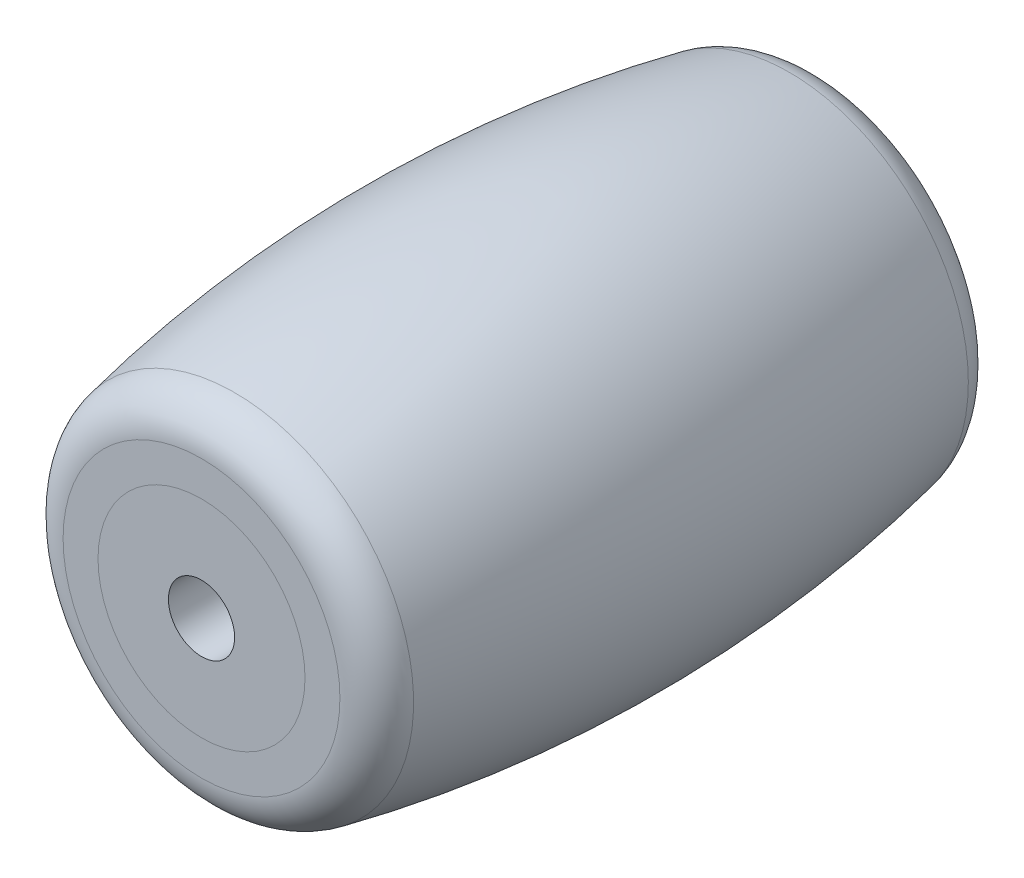
ISO-10303-21;
HEADER;
FILE_DESCRIPTION(('STEP AP214'),'2;1');
FILE_NAME('part.step','',(''),(''),'','','');
FILE_SCHEMA(('AUTOMOTIVE_DESIGN { 1 0 10303 214 1 1 1 1 }'));
ENDSEC;
DATA;
#1=APPLICATION_CONTEXT('core data for automotive mechanical design processes');
#2=APPLICATION_PROTOCOL_DEFINITION('international standard','automotive_design',2000,#1);
#3=PRODUCT_CONTEXT('',#1,'mechanical');
#4=PRODUCT('Part','Part','',(#3));
#5=PRODUCT_RELATED_PRODUCT_CATEGORY('part','',(#4));
#6=PRODUCT_DEFINITION_FORMATION('','',#4);
#7=PRODUCT_DEFINITION_CONTEXT('part definition',#1,'design');
#8=PRODUCT_DEFINITION('design','',#6,#7);
#9=PRODUCT_DEFINITION_SHAPE('','',#8);
#10=(LENGTH_UNIT() NAMED_UNIT(*) SI_UNIT(.MILLI.,.METRE.));
#11=(NAMED_UNIT(*) PLANE_ANGLE_UNIT() SI_UNIT($,.RADIAN.));
#12=(NAMED_UNIT(*) SI_UNIT($,.STERADIAN.) SOLID_ANGLE_UNIT());
#13=UNCERTAINTY_MEASURE_WITH_UNIT(LENGTH_MEASURE(1.E-05),#10,'distance_accuracy_value','');
#14=(GEOMETRIC_REPRESENTATION_CONTEXT(3) GLOBAL_UNCERTAINTY_ASSIGNED_CONTEXT((#13)) GLOBAL_UNIT_ASSIGNED_CONTEXT((#10,
#11,#12)) REPRESENTATION_CONTEXT('',''));
#15=CARTESIAN_POINT('',(0.,0.,0.));
#16=DIRECTION('',(0.,0.,1.));
#17=DIRECTION('',(1.,0.,0.));
#18=AXIS2_PLACEMENT_3D('',#15,#16,#17);
#19=CARTESIAN_POINT('',(0.,0.,15.));
#20=DIRECTION('',(0.,0.,1.));
#21=DIRECTION('',(1.,0.,0.));
#22=AXIS2_PLACEMENT_3D('',#19,#20,#21);
#23=PLANE('',#22);
#24=CARTESIAN_POINT('',(0.,0.,15.));
#25=DIRECTION('',(0.,0.,1.));
#26=DIRECTION('',(1.,0.,0.));
#27=AXIS2_PLACEMENT_3D('',#24,#25,#26);
#28=CIRCLE('',#27,5.);
#29=CARTESIAN_POINT('',(5.,0.,15.));
#30=VERTEX_POINT('',#29);
#31=EDGE_CURVE('E11',#30,#30,#28,.T.);
#32=ORIENTED_EDGE('',*,*,#31,.T.);
#33=EDGE_LOOP('',(#32));
#34=FACE_BOUND('',#33,.T.);
#35=CARTESIAN_POINT('',(0.,0.,15.));
#36=DIRECTION('',(0.,0.,1.));
#37=DIRECTION('',(1.,0.,0.));
#38=AXIS2_PLACEMENT_3D('',#35,#36,#37);
#39=CIRCLE('',#38,1.6);
#40=CARTESIAN_POINT('',(1.6,0.,15.));
#41=VERTEX_POINT('',#40);
#42=EDGE_CURVE('E54',#41,#41,#39,.T.);
#43=ORIENTED_EDGE('',*,*,#42,.F.);
#44=EDGE_LOOP('',(#43));
#45=FACE_BOUND('',#44,.T.);
#46=ADVANCED_FACE('F47',(#34,#45),#23,.T.);
#47=CARTESIAN_POINT('',(0.,0.,15.));
#48=DIRECTION('',(0.,0.,-1.));
#49=DIRECTION('',(-1.,0.,0.));
#50=AXIS2_PLACEMENT_3D('',#47,#48,#49);
#51=CYLINDRICAL_SURFACE('',#50,5.);
#52=ORIENTED_EDGE('',*,*,#31,.F.);
#53=EDGE_LOOP('',(#52));
#54=FACE_BOUND('',#53,.T.);
#55=CARTESIAN_POINT('',(0.,0.,-15.));
#56=DIRECTION('',(0.,0.,1.));
#57=DIRECTION('',(1.,0.,0.));
#58=AXIS2_PLACEMENT_3D('',#55,#56,#57);
#59=CIRCLE('',#58,5.);
#60=CARTESIAN_POINT('',(5.,0.,-15.));
#61=VERTEX_POINT('',#60);
#62=EDGE_CURVE('E58',#61,#61,#59,.T.);
#63=ORIENTED_EDGE('',*,*,#62,.T.);
#64=EDGE_LOOP('',(#63));
#65=FACE_BOUND('',#64,.T.);
#66=ADVANCED_FACE('F49',(#54,#65),#51,.T.);
#67=CARTESIAN_POINT('',(0.,0.,15.));
#68=DIRECTION('',(0.,0.,-1.));
#69=DIRECTION('',(-1.,0.,0.));
#70=AXIS2_PLACEMENT_3D('',#67,#68,#69);
#71=CYLINDRICAL_SURFACE('',#70,1.6);
#72=ORIENTED_EDGE('',*,*,#42,.T.);
#73=EDGE_LOOP('',(#72));
#74=FACE_BOUND('',#73,.T.);
#75=CARTESIAN_POINT('',(0.,0.,-15.));
#76=DIRECTION('',(0.,0.,1.));
#77=DIRECTION('',(1.,0.,0.));
#78=AXIS2_PLACEMENT_3D('',#75,#76,#77);
#79=CIRCLE('',#78,1.6);
#80=CARTESIAN_POINT('',(1.6,0.,-15.));
#81=VERTEX_POINT('',#80);
#82=EDGE_CURVE('E62',#81,#81,#79,.T.);
#83=ORIENTED_EDGE('',*,*,#82,.F.);
#84=EDGE_LOOP('',(#83));
#85=FACE_BOUND('',#84,.T.);
#86=ADVANCED_FACE('F71',(#74,#85),#71,.F.);
#87=CARTESIAN_POINT('',(0.,0.,-15.));
#88=DIRECTION('',(0.,0.,1.));
#89=DIRECTION('',(1.,0.,0.));
#90=AXIS2_PLACEMENT_3D('',#87,#88,#89);
#91=PLANE('',#90);
#92=ORIENTED_EDGE('',*,*,#82,.T.);
#93=EDGE_LOOP('',(#92));
#94=FACE_BOUND('',#93,.T.);
#95=ORIENTED_EDGE('',*,*,#62,.F.);
#96=EDGE_LOOP('',(#95));
#97=FACE_BOUND('',#96,.T.);
#98=ADVANCED_FACE('F68',(#94,#97),#91,.F.);
#99=CLOSED_SHELL('',(#46,#66,#86,#98));
#100=MANIFOLD_SOLID_BREP('B2',#99);
#101=CARTESIAN_POINT('',(0.,5.,15.));
#102=DIRECTION('',(0.,0.,-1.));
#103=DIRECTION('',(-1.,0.,0.));
#104=AXIS2_PLACEMENT_3D('',#101,#102,#103);
#105=PLANE('',#104);
#106=CARTESIAN_POINT('',(0.,0.,15.));
#107=DIRECTION('',(0.,0.,-1.));
#108=DIRECTION('',(-1.,0.,0.));
#109=AXIS2_PLACEMENT_3D('',#106,#107,#108);
#110=CIRCLE('',#109,6.68673331236264);
#111=CARTESIAN_POINT('',(-6.68673331236264,0.,15.));
#112=VERTEX_POINT('',#111);
#113=EDGE_CURVE('E46',#112,#112,#110,.F.);
#114=ORIENTED_EDGE('',*,*,#113,.T.);
#115=EDGE_LOOP('',(#114));
#116=FACE_BOUND('',#115,.T.);
#117=CARTESIAN_POINT('',(0.,0.,15.));
#118=DIRECTION('',(0.,0.,1.));
#119=DIRECTION('',(1.,0.,0.));
#120=AXIS2_PLACEMENT_3D('',#117,#118,#119);
#121=CIRCLE('',#120,5.);
#122=CARTESIAN_POINT('',(5.,0.,15.));
#123=VERTEX_POINT('',#122);
#124=EDGE_CURVE('E137',#123,#123,#121,.T.);
#125=ORIENTED_EDGE('',*,*,#124,.F.);
#126=EDGE_LOOP('',(#125));
#127=FACE_BOUND('',#126,.T.);
#128=ADVANCED_FACE('F117',(#116,#127),#105,.F.);
#129=CARTESIAN_POINT('',(0.,0.,18.551269556302));
#130=DIRECTION('',(0.,0.,1.));
#131=DIRECTION('',(1.,0.,0.));
#132=AXIS2_PLACEMENT_3D('',#129,#130,#131);
#133=CYLINDRICAL_SURFACE('',#132,5.);
#134=CARTESIAN_POINT('',(0.,0.,-15.));
#135=DIRECTION('',(0.,0.,1.));
#136=DIRECTION('',(1.,0.,0.));
#137=AXIS2_PLACEMENT_3D('',#134,#135,#136);
#138=CIRCLE('',#137,5.);
#139=CARTESIAN_POINT('',(5.,0.,-15.));
#140=VERTEX_POINT('',#139);
#141=EDGE_CURVE('E140',#140,#140,#138,.T.);
#142=ORIENTED_EDGE('',*,*,#141,.F.);
#143=EDGE_LOOP('',(#142));
#144=FACE_BOUND('',#143,.T.);
#145=ORIENTED_EDGE('',*,*,#124,.T.);
#146=EDGE_LOOP('',(#145));
#147=FACE_BOUND('',#146,.T.);
#148=ADVANCED_FACE('F146',(#144,#147),#133,.F.);
#149=CARTESIAN_POINT('',(0.,5.,-15.));
#150=DIRECTION('',(0.,0.,1.));
#151=DIRECTION('',(1.,0.,0.));
#152=AXIS2_PLACEMENT_3D('',#149,#150,#151);
#153=PLANE('',#152);
#154=CARTESIAN_POINT('',(0.,0.,-15.));
#155=DIRECTION('',(0.,0.,1.));
#156=DIRECTION('',(1.,0.,0.));
#157=AXIS2_PLACEMENT_3D('',#154,#155,#156);
#158=CIRCLE('',#157,6.68673331236264);
#159=CARTESIAN_POINT('',(6.68673331236264,0.,-15.));
#160=VERTEX_POINT('',#159);
#161=EDGE_CURVE('E124',#160,#160,#158,.F.);
#162=ORIENTED_EDGE('',*,*,#161,.T.);
#163=EDGE_LOOP('',(#162));
#164=FACE_BOUND('',#163,.T.);
#165=ORIENTED_EDGE('',*,*,#141,.T.);
#166=EDGE_LOOP('',(#165));
#167=FACE_BOUND('',#166,.T.);
#168=ADVANCED_FACE('F144',(#164,#167),#153,.F.);
#169=CARTESIAN_POINT('',(0.,0.,0.));
#170=DIRECTION('',(0.,0.,1.));
#171=DIRECTION('',(1.,0.,0.));
#172=AXIS2_PLACEMENT_3D('',#169,#170,#171);
#173=DEGENERATE_TOROIDAL_SURFACE('',#172,57.,67.,.F.);
#174=CARTESIAN_POINT('',(0.,0.,-13.4));
#175=DIRECTION('',(0.,0.,1.));
#176=DIRECTION('',(1.,0.,0.));
#177=AXIS2_PLACEMENT_3D('',#174,#175,#176);
#178=CIRCLE('',#177,8.64632510658919);
#179=CARTESIAN_POINT('',(8.64632510658919,0.,-13.4));
#180=VERTEX_POINT('',#179);
#181=EDGE_CURVE('E128',#180,#180,#178,.T.);
#182=ORIENTED_EDGE('',*,*,#181,.T.);
#183=EDGE_LOOP('',(#182));
#184=FACE_BOUND('',#183,.T.);
#185=CARTESIAN_POINT('',(0.,0.,13.4));
#186=DIRECTION('',(0.,0.,-1.));
#187=DIRECTION('',(-1.,0.,0.));
#188=AXIS2_PLACEMENT_3D('',#185,#186,#187);
#189=CIRCLE('',#188,8.64632510658919);
#190=CARTESIAN_POINT('',(-8.64632510658919,0.,13.4));
#191=VERTEX_POINT('',#190);
#192=EDGE_CURVE('E132',#191,#191,#189,.T.);
#193=ORIENTED_EDGE('',*,*,#192,.T.);
#194=EDGE_LOOP('',(#193));
#195=FACE_BOUND('',#194,.T.);
#196=ADVANCED_FACE('F159',(#184,#195),#173,.F.);
#197=CARTESIAN_POINT('',(0.,0.,-13.));
#198=DIRECTION('',(0.,0.,1.));
#199=DIRECTION('',(1.,0.,0.));
#200=AXIS2_PLACEMENT_3D('',#197,#198,#199);
#201=TOROIDAL_SURFACE('',#200,6.68673331236264,2.);
#202=ORIENTED_EDGE('',*,*,#161,.F.);
#203=EDGE_LOOP('',(#202));
#204=FACE_BOUND('',#203,.T.);
#205=ORIENTED_EDGE('',*,*,#181,.F.);
#206=EDGE_LOOP('',(#205));
#207=FACE_BOUND('',#206,.T.);
#208=ADVANCED_FACE('F157',(#204,#207),#201,.T.);
#209=CARTESIAN_POINT('',(0.,0.,13.));
#210=DIRECTION('',(0.,0.,-1.));
#211=DIRECTION('',(-1.,0.,0.));
#212=AXIS2_PLACEMENT_3D('',#209,#210,#211);
#213=TOROIDAL_SURFACE('',#212,6.68673331236264,2.);
#214=ORIENTED_EDGE('',*,*,#192,.F.);
#215=EDGE_LOOP('',(#214));
#216=FACE_BOUND('',#215,.T.);
#217=ORIENTED_EDGE('',*,*,#113,.F.);
#218=EDGE_LOOP('',(#217));
#219=FACE_BOUND('',#218,.T.);
#220=ADVANCED_FACE('F119',(#216,#219),#213,.T.);
#221=CLOSED_SHELL('',(#128,#148,#168,#196,#208,#220));
#222=MANIFOLD_SOLID_BREP('B6',#221);
#223=ADVANCED_BREP_SHAPE_REPRESENTATION('',(#18,#100,#222),#14);
#224=SHAPE_DEFINITION_REPRESENTATION(#9,#223);
ENDSEC;
END-ISO-10303-21;
